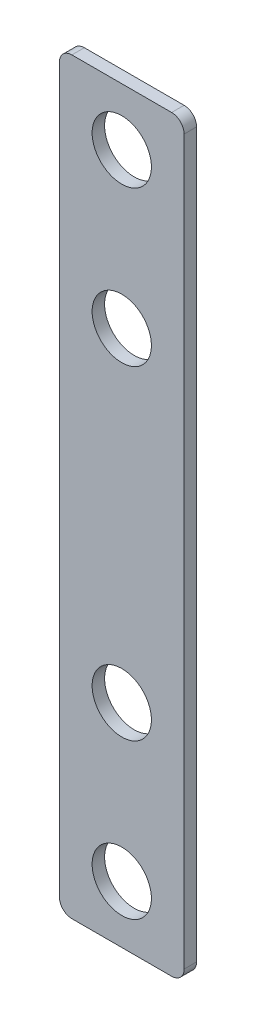
ISO-10303-21;
HEADER;
FILE_DESCRIPTION(('STEP AP214'),'2;1');
FILE_NAME('part.step','',(''),(''),'','','');
FILE_SCHEMA(('AUTOMOTIVE_DESIGN { 1 0 10303 214 1 1 1 1 }'));
ENDSEC;
DATA;
#1=APPLICATION_CONTEXT('core data for automotive mechanical design processes');
#2=APPLICATION_PROTOCOL_DEFINITION('international standard','automotive_design',2000,#1);
#3=PRODUCT_CONTEXT('',#1,'mechanical');
#4=PRODUCT('Part','Part','',(#3));
#5=PRODUCT_RELATED_PRODUCT_CATEGORY('part','',(#4));
#6=PRODUCT_DEFINITION_FORMATION('','',#4);
#7=PRODUCT_DEFINITION_CONTEXT('part definition',#1,'design');
#8=PRODUCT_DEFINITION('design','',#6,#7);
#9=PRODUCT_DEFINITION_SHAPE('','',#8);
#10=(LENGTH_UNIT() NAMED_UNIT(*) SI_UNIT(.MILLI.,.METRE.));
#11=(NAMED_UNIT(*) PLANE_ANGLE_UNIT() SI_UNIT($,.RADIAN.));
#12=(NAMED_UNIT(*) SI_UNIT($,.STERADIAN.) SOLID_ANGLE_UNIT());
#13=UNCERTAINTY_MEASURE_WITH_UNIT(LENGTH_MEASURE(1.E-05),#10,'distance_accuracy_value','');
#14=(GEOMETRIC_REPRESENTATION_CONTEXT(3) GLOBAL_UNCERTAINTY_ASSIGNED_CONTEXT((#13)) GLOBAL_UNIT_ASSIGNED_CONTEXT((#10,
#11,#12)) REPRESENTATION_CONTEXT('',''));
#15=CARTESIAN_POINT('',(0.,0.,0.));
#16=DIRECTION('',(0.,0.,1.));
#17=DIRECTION('',(1.,0.,0.));
#18=AXIS2_PLACEMENT_3D('',#15,#16,#17);
#19=CARTESIAN_POINT('',(0.,0.,0.));
#20=DIRECTION('',(0.,0.,1.));
#21=DIRECTION('',(1.,0.,0.));
#22=AXIS2_PLACEMENT_3D('',#19,#20,#21);
#23=PLANE('',#22);
#24=CARTESIAN_POINT('',(0.,127.,0.));
#25=DIRECTION('',(0.,0.,1.));
#26=DIRECTION('',(1.,0.,0.));
#27=AXIS2_PLACEMENT_3D('',#24,#25,#26);
#28=CIRCLE('',#27,11.8925);
#29=CARTESIAN_POINT('',(11.8925,127.,0.));
#30=VERTEX_POINT('',#29);
#31=EDGE_CURVE('E231',#30,#30,#28,.T.);
#32=ORIENTED_EDGE('',*,*,#31,.T.);
#33=EDGE_LOOP('',(#32));
#34=FACE_BOUND('',#33,.T.);
#35=CARTESIAN_POINT('',(0.,65.,0.));
#36=DIRECTION('',(0.,0.,1.));
#37=DIRECTION('',(1.,0.,0.));
#38=AXIS2_PLACEMENT_3D('',#35,#36,#37);
#39=CIRCLE('',#38,11.8925);
#40=CARTESIAN_POINT('',(11.8925,65.,0.));
#41=VERTEX_POINT('',#40);
#42=EDGE_CURVE('E235',#41,#41,#39,.T.);
#43=ORIENTED_EDGE('',*,*,#42,.T.);
#44=EDGE_LOOP('',(#43));
#45=FACE_BOUND('',#44,.T.);
#46=CARTESIAN_POINT('',(0.,-65.,0.));
#47=DIRECTION('',(0.,0.,1.));
#48=DIRECTION('',(1.,0.,0.));
#49=AXIS2_PLACEMENT_3D('',#46,#47,#48);
#50=CIRCLE('',#49,11.8925);
#51=CARTESIAN_POINT('',(11.8925,-65.,0.));
#52=VERTEX_POINT('',#51);
#53=EDGE_CURVE('E37',#52,#52,#50,.T.);
#54=ORIENTED_EDGE('',*,*,#53,.T.);
#55=EDGE_LOOP('',(#54));
#56=FACE_BOUND('',#55,.T.);
#57=CARTESIAN_POINT('',(0.,-127.,0.));
#58=DIRECTION('',(0.,0.,1.));
#59=DIRECTION('',(1.,0.,0.));
#60=AXIS2_PLACEMENT_3D('',#57,#58,#59);
#61=CIRCLE('',#60,11.8925);
#62=CARTESIAN_POINT('',(11.8925,-127.,0.));
#63=VERTEX_POINT('',#62);
#64=EDGE_CURVE('E155',#63,#63,#61,.T.);
#65=ORIENTED_EDGE('',*,*,#64,.T.);
#66=EDGE_LOOP('',(#65));
#67=FACE_BOUND('',#66,.T.);
#68=DIRECTION('',(-1.,0.,0.));
#69=VECTOR('',#68,1.);
#70=CARTESIAN_POINT('',(-25.,150.,0.));
#71=LINE('',#70,#69);
#72=CARTESIAN_POINT('',(20.,150.,0.));
#73=VERTEX_POINT('',#72);
#74=CARTESIAN_POINT('',(-20.,150.,0.));
#75=VERTEX_POINT('',#74);
#76=EDGE_CURVE('E118',#73,#75,#71,.T.);
#77=ORIENTED_EDGE('',*,*,#76,.F.);
#78=CARTESIAN_POINT('',(20.,145.,0.));
#79=DIRECTION('',(0.,0.,1.));
#80=DIRECTION('',(1.,0.,0.));
#81=AXIS2_PLACEMENT_3D('',#78,#79,#80);
#82=CIRCLE('',#81,5.);
#83=CARTESIAN_POINT('',(25.,145.,0.));
#84=VERTEX_POINT('',#83);
#85=EDGE_CURVE('E101',#73,#84,#82,.F.);
#86=ORIENTED_EDGE('',*,*,#85,.T.);
#87=DIRECTION('',(0.,1.,0.));
#88=VECTOR('',#87,1.);
#89=CARTESIAN_POINT('',(25.,150.,0.));
#90=LINE('',#89,#88);
#91=CARTESIAN_POINT('',(25.,-145.,0.));
#92=VERTEX_POINT('',#91);
#93=EDGE_CURVE('E127',#92,#84,#90,.T.);
#94=ORIENTED_EDGE('',*,*,#93,.F.);
#95=CARTESIAN_POINT('',(20.,-145.,0.));
#96=DIRECTION('',(0.,0.,1.));
#97=DIRECTION('',(1.,0.,0.));
#98=AXIS2_PLACEMENT_3D('',#95,#96,#97);
#99=CIRCLE('',#98,5.);
#100=CARTESIAN_POINT('',(20.,-150.,0.));
#101=VERTEX_POINT('',#100);
#102=EDGE_CURVE('E112',#92,#101,#99,.F.);
#103=ORIENTED_EDGE('',*,*,#102,.T.);
#104=DIRECTION('',(1.,0.,0.));
#105=VECTOR('',#104,1.);
#106=CARTESIAN_POINT('',(-25.,-150.,0.));
#107=LINE('',#106,#105);
#108=CARTESIAN_POINT('',(-20.,-150.,0.));
#109=VERTEX_POINT('',#108);
#110=EDGE_CURVE('E131',#109,#101,#107,.T.);
#111=ORIENTED_EDGE('',*,*,#110,.F.);
#112=CARTESIAN_POINT('',(-20.,-145.,0.));
#113=DIRECTION('',(0.,0.,1.));
#114=DIRECTION('',(1.,0.,0.));
#115=AXIS2_PLACEMENT_3D('',#112,#113,#114);
#116=CIRCLE('',#115,5.);
#117=CARTESIAN_POINT('',(-25.,-145.,0.));
#118=VERTEX_POINT('',#117);
#119=EDGE_CURVE('E137',#109,#118,#116,.F.);
#120=ORIENTED_EDGE('',*,*,#119,.T.);
#121=DIRECTION('',(0.,-1.,0.));
#122=VECTOR('',#121,1.);
#123=CARTESIAN_POINT('',(-25.,150.,0.));
#124=LINE('',#123,#122);
#125=CARTESIAN_POINT('',(-25.,145.,0.));
#126=VERTEX_POINT('',#125);
#127=EDGE_CURVE('E157',#126,#118,#124,.T.);
#128=ORIENTED_EDGE('',*,*,#127,.F.);
#129=CARTESIAN_POINT('',(-20.,145.,0.));
#130=DIRECTION('',(0.,0.,1.));
#131=DIRECTION('',(1.,0.,0.));
#132=AXIS2_PLACEMENT_3D('',#129,#130,#131);
#133=CIRCLE('',#132,5.);
#134=EDGE_CURVE('E122',#126,#75,#133,.F.);
#135=ORIENTED_EDGE('',*,*,#134,.T.);
#136=EDGE_LOOP('',(#77,#86,#94,#103,#111,#120,#128,#135));
#137=FACE_BOUND('',#136,.T.);
#138=ADVANCED_FACE('F33',(#34,#45,#56,#67,#137),#23,.F.);
#139=CARTESIAN_POINT('',(-25.,150.,5.));
#140=DIRECTION('',(1.,0.,0.));
#141=DIRECTION('',(0.,1.,0.));
#142=AXIS2_PLACEMENT_3D('',#139,#140,#141);
#143=PLANE('',#142);
#144=ORIENTED_EDGE('',*,*,#127,.T.);
#145=DIRECTION('',(0.,0.,-1.));
#146=VECTOR('',#145,1.);
#147=CARTESIAN_POINT('',(-25.,-145.,5.));
#148=LINE('',#147,#146);
#149=CARTESIAN_POINT('',(-25.,-145.,5.));
#150=VERTEX_POINT('',#149);
#151=EDGE_CURVE('E11',#118,#150,#148,.F.);
#152=ORIENTED_EDGE('',*,*,#151,.T.);
#153=DIRECTION('',(0.,-1.,0.));
#154=VECTOR('',#153,1.);
#155=CARTESIAN_POINT('',(-25.,150.,5.));
#156=LINE('',#155,#154);
#157=CARTESIAN_POINT('',(-25.,145.,5.));
#158=VERTEX_POINT('',#157);
#159=EDGE_CURVE('E126',#158,#150,#156,.T.);
#160=ORIENTED_EDGE('',*,*,#159,.F.);
#161=DIRECTION('',(0.,0.,-1.));
#162=VECTOR('',#161,1.);
#163=CARTESIAN_POINT('',(-25.,145.,5.));
#164=LINE('',#163,#162);
#165=EDGE_CURVE('E42',#158,#126,#164,.T.);
#166=ORIENTED_EDGE('',*,*,#165,.T.);
#167=EDGE_LOOP('',(#144,#152,#160,#166));
#168=FACE_BOUND('',#167,.T.);
#169=ADVANCED_FACE('F194',(#168),#143,.F.);
#170=CARTESIAN_POINT('',(-25.,-150.,5.));
#171=DIRECTION('',(0.,1.,0.));
#172=DIRECTION('',(0.,0.,1.));
#173=AXIS2_PLACEMENT_3D('',#170,#171,#172);
#174=PLANE('',#173);
#175=ORIENTED_EDGE('',*,*,#110,.T.);
#176=DIRECTION('',(0.,0.,-1.));
#177=VECTOR('',#176,1.);
#178=CARTESIAN_POINT('',(20.,-150.,5.));
#179=LINE('',#178,#177);
#180=CARTESIAN_POINT('',(20.,-150.,5.));
#181=VERTEX_POINT('',#180);
#182=EDGE_CURVE('E50',#101,#181,#179,.F.);
#183=ORIENTED_EDGE('',*,*,#182,.T.);
#184=DIRECTION('',(1.,0.,0.));
#185=VECTOR('',#184,1.);
#186=CARTESIAN_POINT('',(-25.,-150.,5.));
#187=LINE('',#186,#185);
#188=CARTESIAN_POINT('',(-20.,-150.,5.));
#189=VERTEX_POINT('',#188);
#190=EDGE_CURVE('E129',#189,#181,#187,.T.);
#191=ORIENTED_EDGE('',*,*,#190,.F.);
#192=DIRECTION('',(0.,0.,-1.));
#193=VECTOR('',#192,1.);
#194=CARTESIAN_POINT('',(-20.,-150.,5.));
#195=LINE('',#194,#193);
#196=EDGE_CURVE('E150',#189,#109,#195,.T.);
#197=ORIENTED_EDGE('',*,*,#196,.T.);
#198=EDGE_LOOP('',(#175,#183,#191,#197));
#199=FACE_BOUND('',#198,.T.);
#200=ADVANCED_FACE('F177',(#199),#174,.F.);
#201=CARTESIAN_POINT('',(25.,150.,5.));
#202=DIRECTION('',(-1.,0.,0.));
#203=DIRECTION('',(0.,-1.,0.));
#204=AXIS2_PLACEMENT_3D('',#201,#202,#203);
#205=PLANE('',#204);
#206=ORIENTED_EDGE('',*,*,#93,.T.);
#207=DIRECTION('',(0.,0.,-1.));
#208=VECTOR('',#207,1.);
#209=CARTESIAN_POINT('',(25.,145.,5.));
#210=LINE('',#209,#208);
#211=CARTESIAN_POINT('',(25.,145.,5.));
#212=VERTEX_POINT('',#211);
#213=EDGE_CURVE('E106',#84,#212,#210,.F.);
#214=ORIENTED_EDGE('',*,*,#213,.T.);
#215=DIRECTION('',(0.,1.,0.));
#216=VECTOR('',#215,1.);
#217=CARTESIAN_POINT('',(25.,150.,5.));
#218=LINE('',#217,#216);
#219=CARTESIAN_POINT('',(25.,-145.,5.));
#220=VERTEX_POINT('',#219);
#221=EDGE_CURVE('E173',#220,#212,#218,.T.);
#222=ORIENTED_EDGE('',*,*,#221,.F.);
#223=DIRECTION('',(0.,0.,-1.));
#224=VECTOR('',#223,1.);
#225=CARTESIAN_POINT('',(25.,-145.,5.));
#226=LINE('',#225,#224);
#227=EDGE_CURVE('E111',#220,#92,#226,.T.);
#228=ORIENTED_EDGE('',*,*,#227,.T.);
#229=EDGE_LOOP('',(#206,#214,#222,#228));
#230=FACE_BOUND('',#229,.T.);
#231=ADVANCED_FACE('F186',(#230),#205,.F.);
#232=CARTESIAN_POINT('',(-25.,150.,5.));
#233=DIRECTION('',(0.,-1.,0.));
#234=DIRECTION('',(0.,0.,-1.));
#235=AXIS2_PLACEMENT_3D('',#232,#233,#234);
#236=PLANE('',#235);
#237=DIRECTION('',(-1.,0.,0.));
#238=VECTOR('',#237,1.);
#239=CARTESIAN_POINT('',(-25.,150.,5.));
#240=LINE('',#239,#238);
#241=CARTESIAN_POINT('',(20.,150.,5.));
#242=VERTEX_POINT('',#241);
#243=CARTESIAN_POINT('',(-20.,150.,5.));
#244=VERTEX_POINT('',#243);
#245=EDGE_CURVE('E121',#242,#244,#240,.T.);
#246=ORIENTED_EDGE('',*,*,#245,.F.);
#247=DIRECTION('',(0.,0.,-1.));
#248=VECTOR('',#247,1.);
#249=CARTESIAN_POINT('',(20.,150.,5.));
#250=LINE('',#249,#248);
#251=EDGE_CURVE('E105',#242,#73,#250,.T.);
#252=ORIENTED_EDGE('',*,*,#251,.T.);
#253=ORIENTED_EDGE('',*,*,#76,.T.);
#254=DIRECTION('',(0.,0.,-1.));
#255=VECTOR('',#254,1.);
#256=CARTESIAN_POINT('',(-20.,150.,5.));
#257=LINE('',#256,#255);
#258=EDGE_CURVE('E123',#75,#244,#257,.F.);
#259=ORIENTED_EDGE('',*,*,#258,.T.);
#260=EDGE_LOOP('',(#246,#252,#253,#259));
#261=FACE_BOUND('',#260,.T.);
#262=ADVANCED_FACE('F117',(#261),#236,.F.);
#263=CARTESIAN_POINT('',(0.,0.,5.));
#264=DIRECTION('',(0.,0.,1.));
#265=DIRECTION('',(1.,0.,0.));
#266=AXIS2_PLACEMENT_3D('',#263,#264,#265);
#267=PLANE('',#266);
#268=CARTESIAN_POINT('',(0.,127.,5.));
#269=DIRECTION('',(0.,0.,1.));
#270=DIRECTION('',(1.,0.,0.));
#271=AXIS2_PLACEMENT_3D('',#268,#269,#270);
#272=CIRCLE('',#271,11.8925);
#273=CARTESIAN_POINT('',(11.8925,127.,5.));
#274=VERTEX_POINT('',#273);
#275=EDGE_CURVE('E229',#274,#274,#272,.T.);
#276=ORIENTED_EDGE('',*,*,#275,.F.);
#277=EDGE_LOOP('',(#276));
#278=FACE_BOUND('',#277,.T.);
#279=CARTESIAN_POINT('',(0.,65.,5.));
#280=DIRECTION('',(0.,0.,1.));
#281=DIRECTION('',(1.,0.,0.));
#282=AXIS2_PLACEMENT_3D('',#279,#280,#281);
#283=CIRCLE('',#282,11.8925);
#284=CARTESIAN_POINT('',(11.8925,65.,5.));
#285=VERTEX_POINT('',#284);
#286=EDGE_CURVE('E232',#285,#285,#283,.T.);
#287=ORIENTED_EDGE('',*,*,#286,.F.);
#288=EDGE_LOOP('',(#287));
#289=FACE_BOUND('',#288,.T.);
#290=CARTESIAN_POINT('',(0.,-65.,5.));
#291=DIRECTION('',(0.,0.,1.));
#292=DIRECTION('',(1.,0.,0.));
#293=AXIS2_PLACEMENT_3D('',#290,#291,#292);
#294=CIRCLE('',#293,11.8925);
#295=CARTESIAN_POINT('',(11.8925,-65.,5.));
#296=VERTEX_POINT('',#295);
#297=EDGE_CURVE('E168',#296,#296,#294,.T.);
#298=ORIENTED_EDGE('',*,*,#297,.F.);
#299=EDGE_LOOP('',(#298));
#300=FACE_BOUND('',#299,.T.);
#301=CARTESIAN_POINT('',(0.,-127.,5.));
#302=DIRECTION('',(0.,0.,1.));
#303=DIRECTION('',(1.,0.,0.));
#304=AXIS2_PLACEMENT_3D('',#301,#302,#303);
#305=CIRCLE('',#304,11.8925);
#306=CARTESIAN_POINT('',(11.8925,-127.,5.));
#307=VERTEX_POINT('',#306);
#308=EDGE_CURVE('E158',#307,#307,#305,.T.);
#309=ORIENTED_EDGE('',*,*,#308,.F.);
#310=EDGE_LOOP('',(#309));
#311=FACE_BOUND('',#310,.T.);
#312=ORIENTED_EDGE('',*,*,#221,.T.);
#313=CARTESIAN_POINT('',(20.,145.,5.));
#314=DIRECTION('',(0.,0.,1.));
#315=DIRECTION('',(1.,0.,0.));
#316=AXIS2_PLACEMENT_3D('',#313,#314,#315);
#317=CIRCLE('',#316,5.);
#318=EDGE_CURVE('E148',#212,#242,#317,.T.);
#319=ORIENTED_EDGE('',*,*,#318,.T.);
#320=ORIENTED_EDGE('',*,*,#245,.T.);
#321=CARTESIAN_POINT('',(-20.,145.,5.));
#322=DIRECTION('',(0.,0.,1.));
#323=DIRECTION('',(1.,0.,0.));
#324=AXIS2_PLACEMENT_3D('',#321,#322,#323);
#325=CIRCLE('',#324,5.);
#326=EDGE_CURVE('E143',#244,#158,#325,.T.);
#327=ORIENTED_EDGE('',*,*,#326,.T.);
#328=ORIENTED_EDGE('',*,*,#159,.T.);
#329=CARTESIAN_POINT('',(-20.,-145.,5.));
#330=DIRECTION('',(0.,0.,1.));
#331=DIRECTION('',(1.,0.,0.));
#332=AXIS2_PLACEMENT_3D('',#329,#330,#331);
#333=CIRCLE('',#332,5.);
#334=EDGE_CURVE('E57',#150,#189,#333,.T.);
#335=ORIENTED_EDGE('',*,*,#334,.T.);
#336=ORIENTED_EDGE('',*,*,#190,.T.);
#337=CARTESIAN_POINT('',(20.,-145.,5.));
#338=DIRECTION('',(0.,0.,1.));
#339=DIRECTION('',(1.,0.,0.));
#340=AXIS2_PLACEMENT_3D('',#337,#338,#339);
#341=CIRCLE('',#340,5.);
#342=EDGE_CURVE('E146',#181,#220,#341,.T.);
#343=ORIENTED_EDGE('',*,*,#342,.T.);
#344=EDGE_LOOP('',(#312,#319,#320,#327,#328,#335,#336,#343));
#345=FACE_BOUND('',#344,.T.);
#346=ADVANCED_FACE('F184',(#278,#289,#300,#311,#345),#267,.T.);
#347=CARTESIAN_POINT('',(20.,145.,5.));
#348=DIRECTION('',(0.,0.,-1.));
#349=DIRECTION('',(-1.,0.,0.));
#350=AXIS2_PLACEMENT_3D('',#347,#348,#349);
#351=CYLINDRICAL_SURFACE('',#350,5.);
#352=ORIENTED_EDGE('',*,*,#318,.F.);
#353=ORIENTED_EDGE('',*,*,#213,.F.);
#354=ORIENTED_EDGE('',*,*,#85,.F.);
#355=ORIENTED_EDGE('',*,*,#251,.F.);
#356=EDGE_LOOP('',(#352,#353,#354,#355));
#357=FACE_BOUND('',#356,.T.);
#358=ADVANCED_FACE('F104',(#357),#351,.T.);
#359=CARTESIAN_POINT('',(20.,-145.,5.));
#360=DIRECTION('',(0.,0.,-1.));
#361=DIRECTION('',(-1.,0.,0.));
#362=AXIS2_PLACEMENT_3D('',#359,#360,#361);
#363=CYLINDRICAL_SURFACE('',#362,5.);
#364=ORIENTED_EDGE('',*,*,#342,.F.);
#365=ORIENTED_EDGE('',*,*,#182,.F.);
#366=ORIENTED_EDGE('',*,*,#102,.F.);
#367=ORIENTED_EDGE('',*,*,#227,.F.);
#368=EDGE_LOOP('',(#364,#365,#366,#367));
#369=FACE_BOUND('',#368,.T.);
#370=ADVANCED_FACE('F181',(#369),#363,.T.);
#371=CARTESIAN_POINT('',(-20.,-145.,5.));
#372=DIRECTION('',(0.,0.,-1.));
#373=DIRECTION('',(-1.,0.,0.));
#374=AXIS2_PLACEMENT_3D('',#371,#372,#373);
#375=CYLINDRICAL_SURFACE('',#374,5.);
#376=ORIENTED_EDGE('',*,*,#334,.F.);
#377=ORIENTED_EDGE('',*,*,#151,.F.);
#378=ORIENTED_EDGE('',*,*,#119,.F.);
#379=ORIENTED_EDGE('',*,*,#196,.F.);
#380=EDGE_LOOP('',(#376,#377,#378,#379));
#381=FACE_BOUND('',#380,.T.);
#382=ADVANCED_FACE('F269',(#381),#375,.T.);
#383=CARTESIAN_POINT('',(-20.,145.,5.));
#384=DIRECTION('',(0.,0.,-1.));
#385=DIRECTION('',(-1.,0.,0.));
#386=AXIS2_PLACEMENT_3D('',#383,#384,#385);
#387=CYLINDRICAL_SURFACE('',#386,5.);
#388=ORIENTED_EDGE('',*,*,#326,.F.);
#389=ORIENTED_EDGE('',*,*,#258,.F.);
#390=ORIENTED_EDGE('',*,*,#134,.F.);
#391=ORIENTED_EDGE('',*,*,#165,.F.);
#392=EDGE_LOOP('',(#388,#389,#390,#391));
#393=FACE_BOUND('',#392,.T.);
#394=ADVANCED_FACE('F35',(#393),#387,.T.);
#395=CARTESIAN_POINT('',(0.,-127.,5.));
#396=DIRECTION('',(0.,0.,1.));
#397=DIRECTION('',(1.,0.,0.));
#398=AXIS2_PLACEMENT_3D('',#395,#396,#397);
#399=CYLINDRICAL_SURFACE('',#398,11.8925);
#400=ORIENTED_EDGE('',*,*,#308,.T.);
#401=EDGE_LOOP('',(#400));
#402=FACE_BOUND('',#401,.T.);
#403=ORIENTED_EDGE('',*,*,#64,.F.);
#404=EDGE_LOOP('',(#403));
#405=FACE_BOUND('',#404,.T.);
#406=ADVANCED_FACE('F210',(#402,#405),#399,.F.);
#407=CARTESIAN_POINT('',(0.,-65.,5.));
#408=DIRECTION('',(0.,0.,1.));
#409=DIRECTION('',(1.,0.,0.));
#410=AXIS2_PLACEMENT_3D('',#407,#408,#409);
#411=CYLINDRICAL_SURFACE('',#410,11.8925);
#412=ORIENTED_EDGE('',*,*,#297,.T.);
#413=EDGE_LOOP('',(#412));
#414=FACE_BOUND('',#413,.T.);
#415=ORIENTED_EDGE('',*,*,#53,.F.);
#416=EDGE_LOOP('',(#415));
#417=FACE_BOUND('',#416,.T.);
#418=ADVANCED_FACE('F213',(#414,#417),#411,.F.);
#419=CARTESIAN_POINT('',(0.,65.,5.));
#420=DIRECTION('',(0.,0.,1.));
#421=DIRECTION('',(1.,0.,0.));
#422=AXIS2_PLACEMENT_3D('',#419,#420,#421);
#423=CYLINDRICAL_SURFACE('',#422,11.8925);
#424=ORIENTED_EDGE('',*,*,#286,.T.);
#425=EDGE_LOOP('',(#424));
#426=FACE_BOUND('',#425,.T.);
#427=ORIENTED_EDGE('',*,*,#42,.F.);
#428=EDGE_LOOP('',(#427));
#429=FACE_BOUND('',#428,.T.);
#430=ADVANCED_FACE('F216',(#426,#429),#423,.F.);
#431=CARTESIAN_POINT('',(0.,127.,5.));
#432=DIRECTION('',(0.,0.,1.));
#433=DIRECTION('',(1.,0.,0.));
#434=AXIS2_PLACEMENT_3D('',#431,#432,#433);
#435=CYLINDRICAL_SURFACE('',#434,11.8925);
#436=ORIENTED_EDGE('',*,*,#275,.T.);
#437=EDGE_LOOP('',(#436));
#438=FACE_BOUND('',#437,.T.);
#439=ORIENTED_EDGE('',*,*,#31,.F.);
#440=EDGE_LOOP('',(#439));
#441=FACE_BOUND('',#440,.T.);
#442=ADVANCED_FACE('F220',(#438,#441),#435,.F.);
#443=CLOSED_SHELL('',(#138,#169,#200,#231,#262,#346,#358,#370,#382,#394,#406,#418,#430,#442));
#444=MANIFOLD_SOLID_BREP('B2',#443);
#445=ADVANCED_BREP_SHAPE_REPRESENTATION('',(#18,#444),#14);
#446=SHAPE_DEFINITION_REPRESENTATION(#9,#445);
ENDSEC;
END-ISO-10303-21;
